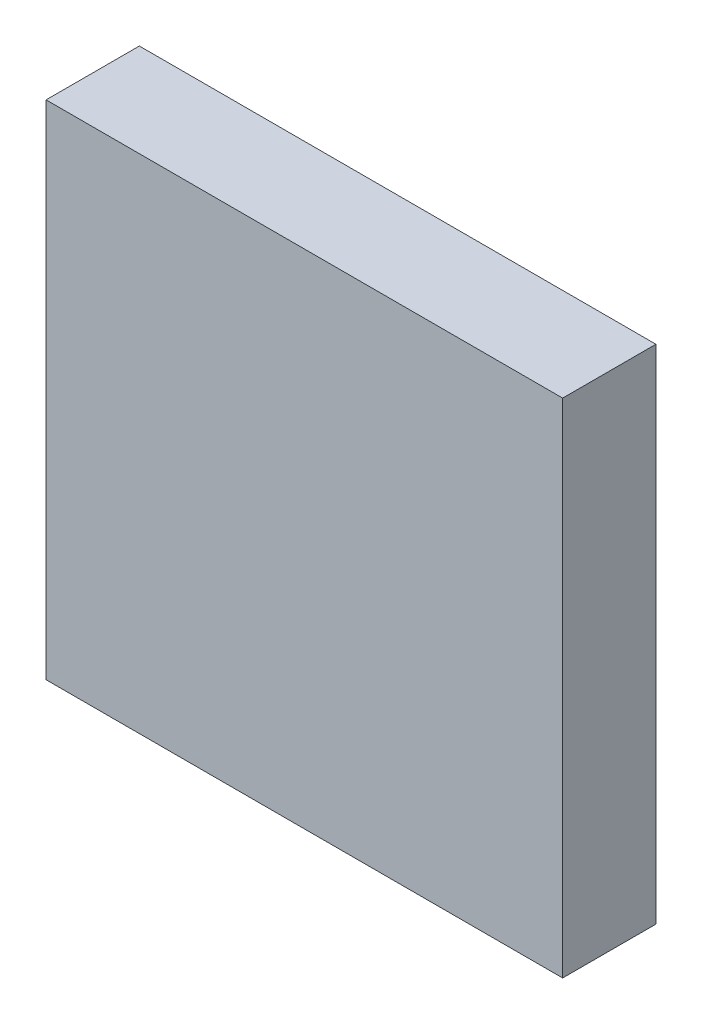
ISO-10303-21;
HEADER;
FILE_DESCRIPTION(('STEP AP214'),'2;1');
FILE_NAME('part.step','',(''),(''),'','','');
FILE_SCHEMA(('AUTOMOTIVE_DESIGN { 1 0 10303 214 1 1 1 1 }'));
ENDSEC;
DATA;
#1=APPLICATION_CONTEXT('core data for automotive mechanical design processes');
#2=APPLICATION_PROTOCOL_DEFINITION('international standard','automotive_design',2000,#1);
#3=PRODUCT_CONTEXT('',#1,'mechanical');
#4=PRODUCT('Part','Part','',(#3));
#5=PRODUCT_RELATED_PRODUCT_CATEGORY('part','',(#4));
#6=PRODUCT_DEFINITION_FORMATION('','',#4);
#7=PRODUCT_DEFINITION_CONTEXT('part definition',#1,'design');
#8=PRODUCT_DEFINITION('design','',#6,#7);
#9=PRODUCT_DEFINITION_SHAPE('','',#8);
#10=(LENGTH_UNIT() NAMED_UNIT(*) SI_UNIT(.MILLI.,.METRE.));
#11=(NAMED_UNIT(*) PLANE_ANGLE_UNIT() SI_UNIT($,.RADIAN.));
#12=(NAMED_UNIT(*) SI_UNIT($,.STERADIAN.) SOLID_ANGLE_UNIT());
#13=UNCERTAINTY_MEASURE_WITH_UNIT(LENGTH_MEASURE(1.E-05),#10,'distance_accuracy_value','');
#14=(GEOMETRIC_REPRESENTATION_CONTEXT(3) GLOBAL_UNCERTAINTY_ASSIGNED_CONTEXT((#13)) GLOBAL_UNIT_ASSIGNED_CONTEXT((#10,
#11,#12)) REPRESENTATION_CONTEXT('',''));
#15=CARTESIAN_POINT('',(0.,0.,0.));
#16=DIRECTION('',(0.,0.,1.));
#17=DIRECTION('',(1.,0.,0.));
#18=AXIS2_PLACEMENT_3D('',#15,#16,#17);
#19=CARTESIAN_POINT('',(-76.5,350.,-7.25));
#20=DIRECTION('',(1.,0.,0.));
#21=DIRECTION('',(0.,0.,-1.));
#22=AXIS2_PLACEMENT_3D('',#19,#20,#21);
#23=PLANE('',#22);
#24=DIRECTION('',(0.,0.,1.));
#25=VECTOR('',#24,1.);
#26=CARTESIAN_POINT('',(-76.5,0.,-7.25));
#27=LINE('',#26,#25);
#28=CARTESIAN_POINT('',(-76.5,0.,-7.25));
#29=VERTEX_POINT('',#28);
#30=CARTESIAN_POINT('',(-76.5,0.,57.75));
#31=VERTEX_POINT('',#30);
#32=EDGE_CURVE('E96',#29,#31,#27,.T.);
#33=ORIENTED_EDGE('',*,*,#32,.T.);
#34=DIRECTION('',(0.,-1.,0.));
#35=VECTOR('',#34,1.);
#36=CARTESIAN_POINT('',(-76.5,350.,57.75));
#37=LINE('',#36,#35);
#38=CARTESIAN_POINT('',(-76.5,350.,57.75));
#39=VERTEX_POINT('',#38);
#40=EDGE_CURVE('E11',#39,#31,#37,.T.);
#41=ORIENTED_EDGE('',*,*,#40,.F.);
#42=DIRECTION('',(0.,0.,1.));
#43=VECTOR('',#42,1.);
#44=CARTESIAN_POINT('',(-76.5,350.,-7.25));
#45=LINE('',#44,#43);
#46=CARTESIAN_POINT('',(-76.5,350.,-7.25));
#47=VERTEX_POINT('',#46);
#48=EDGE_CURVE('E84',#47,#39,#45,.T.);
#49=ORIENTED_EDGE('',*,*,#48,.F.);
#50=DIRECTION('',(0.,-1.,0.));
#51=VECTOR('',#50,1.);
#52=CARTESIAN_POINT('',(-76.5,350.,-7.25));
#53=LINE('',#52,#51);
#54=EDGE_CURVE('E92',#47,#29,#53,.T.);
#55=ORIENTED_EDGE('',*,*,#54,.T.);
#56=EDGE_LOOP('',(#33,#41,#49,#55));
#57=FACE_BOUND('',#56,.T.);
#58=ADVANCED_FACE('F33',(#57),#23,.F.);
#59=CARTESIAN_POINT('',(-76.5,350.,57.75));
#60=DIRECTION('',(0.,0.,-1.));
#61=DIRECTION('',(-1.,0.,0.));
#62=AXIS2_PLACEMENT_3D('',#59,#60,#61);
#63=PLANE('',#62);
#64=DIRECTION('',(1.,0.,0.));
#65=VECTOR('',#64,1.);
#66=CARTESIAN_POINT('',(-76.5,0.,57.75));
#67=LINE('',#66,#65);
#68=CARTESIAN_POINT('',(283.5,0.,57.75));
#69=VERTEX_POINT('',#68);
#70=EDGE_CURVE('E88',#31,#69,#67,.T.);
#71=ORIENTED_EDGE('',*,*,#70,.T.);
#72=DIRECTION('',(0.,-1.,0.));
#73=VECTOR('',#72,1.);
#74=CARTESIAN_POINT('',(283.5,350.,57.75));
#75=LINE('',#74,#73);
#76=CARTESIAN_POINT('',(283.5,350.,57.75));
#77=VERTEX_POINT('',#76);
#78=EDGE_CURVE('E41',#77,#69,#75,.T.);
#79=ORIENTED_EDGE('',*,*,#78,.F.);
#80=DIRECTION('',(1.,0.,0.));
#81=VECTOR('',#80,1.);
#82=CARTESIAN_POINT('',(-76.5,350.,57.75));
#83=LINE('',#82,#81);
#84=EDGE_CURVE('E79',#39,#77,#83,.T.);
#85=ORIENTED_EDGE('',*,*,#84,.F.);
#86=ORIENTED_EDGE('',*,*,#40,.T.);
#87=EDGE_LOOP('',(#71,#79,#85,#86));
#88=FACE_BOUND('',#87,.T.);
#89=ADVANCED_FACE('F87',(#88),#63,.F.);
#90=CARTESIAN_POINT('',(283.5,350.,-7.25));
#91=DIRECTION('',(-1.,0.,0.));
#92=DIRECTION('',(0.,0.,1.));
#93=AXIS2_PLACEMENT_3D('',#90,#91,#92);
#94=PLANE('',#93);
#95=DIRECTION('',(0.,0.,-1.));
#96=VECTOR('',#95,1.);
#97=CARTESIAN_POINT('',(283.5,0.,-7.25));
#98=LINE('',#97,#96);
#99=CARTESIAN_POINT('',(283.5,0.,-7.25));
#100=VERTEX_POINT('',#99);
#101=EDGE_CURVE('E66',#69,#100,#98,.T.);
#102=ORIENTED_EDGE('',*,*,#101,.T.);
#103=DIRECTION('',(0.,-1.,0.));
#104=VECTOR('',#103,1.);
#105=CARTESIAN_POINT('',(283.5,350.,-7.25));
#106=LINE('',#105,#104);
#107=CARTESIAN_POINT('',(283.5,350.,-7.25));
#108=VERTEX_POINT('',#107);
#109=EDGE_CURVE('E89',#108,#100,#106,.T.);
#110=ORIENTED_EDGE('',*,*,#109,.F.);
#111=DIRECTION('',(0.,0.,-1.));
#112=VECTOR('',#111,1.);
#113=CARTESIAN_POINT('',(283.5,350.,-7.25));
#114=LINE('',#113,#112);
#115=EDGE_CURVE('E82',#77,#108,#114,.T.);
#116=ORIENTED_EDGE('',*,*,#115,.F.);
#117=ORIENTED_EDGE('',*,*,#78,.T.);
#118=EDGE_LOOP('',(#102,#110,#116,#117));
#119=FACE_BOUND('',#118,.T.);
#120=ADVANCED_FACE('F90',(#119),#94,.F.);
#121=CARTESIAN_POINT('',(-76.5,350.,-7.25));
#122=DIRECTION('',(0.,0.,1.));
#123=DIRECTION('',(1.,0.,0.));
#124=AXIS2_PLACEMENT_3D('',#121,#122,#123);
#125=PLANE('',#124);
#126=DIRECTION('',(-1.,0.,0.));
#127=VECTOR('',#126,1.);
#128=CARTESIAN_POINT('',(-76.5,0.,-7.25));
#129=LINE('',#128,#127);
#130=EDGE_CURVE('E72',#100,#29,#129,.T.);
#131=ORIENTED_EDGE('',*,*,#130,.T.);
#132=ORIENTED_EDGE('',*,*,#54,.F.);
#133=DIRECTION('',(-1.,0.,0.));
#134=VECTOR('',#133,1.);
#135=CARTESIAN_POINT('',(-76.5,350.,-7.25));
#136=LINE('',#135,#134);
#137=EDGE_CURVE('E49',#108,#47,#136,.T.);
#138=ORIENTED_EDGE('',*,*,#137,.F.);
#139=ORIENTED_EDGE('',*,*,#109,.T.);
#140=EDGE_LOOP('',(#131,#132,#138,#139));
#141=FACE_BOUND('',#140,.T.);
#142=ADVANCED_FACE('F103',(#141),#125,.F.);
#143=CARTESIAN_POINT('',(0.,350.,0.));
#144=DIRECTION('',(0.,1.,0.));
#145=DIRECTION('',(0.,0.,1.));
#146=AXIS2_PLACEMENT_3D('',#143,#144,#145);
#147=PLANE('',#146);
#148=ORIENTED_EDGE('',*,*,#48,.T.);
#149=ORIENTED_EDGE('',*,*,#84,.T.);
#150=ORIENTED_EDGE('',*,*,#115,.T.);
#151=ORIENTED_EDGE('',*,*,#137,.T.);
#152=EDGE_LOOP('',(#148,#149,#150,#151));
#153=FACE_BOUND('',#152,.T.);
#154=ADVANCED_FACE('F80',(#153),#147,.T.);
#155=CARTESIAN_POINT('',(0.,0.,0.));
#156=DIRECTION('',(0.,1.,0.));
#157=DIRECTION('',(0.,0.,1.));
#158=AXIS2_PLACEMENT_3D('',#155,#156,#157);
#159=PLANE('',#158);
#160=ORIENTED_EDGE('',*,*,#32,.F.);
#161=ORIENTED_EDGE('',*,*,#130,.F.);
#162=ORIENTED_EDGE('',*,*,#101,.F.);
#163=ORIENTED_EDGE('',*,*,#70,.F.);
#164=EDGE_LOOP('',(#160,#161,#162,#163));
#165=FACE_BOUND('',#164,.T.);
#166=ADVANCED_FACE('F106',(#165),#159,.F.);
#167=CLOSED_SHELL('',(#58,#89,#120,#142,#154,#166));
#168=MANIFOLD_SOLID_BREP('B2',#167);
#169=ADVANCED_BREP_SHAPE_REPRESENTATION('',(#18,#168),#14);
#170=SHAPE_DEFINITION_REPRESENTATION(#9,#169);
ENDSEC;
END-ISO-10303-21;
